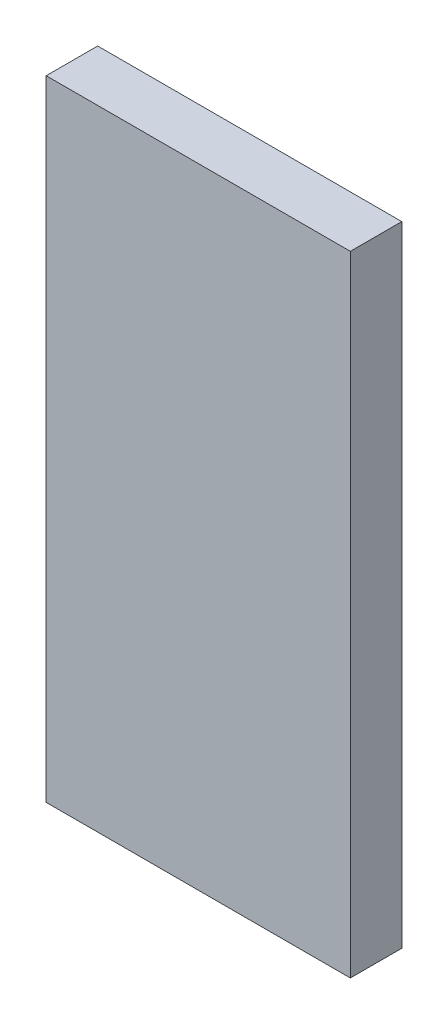
ISO-10303-21;
HEADER;
FILE_DESCRIPTION(('STEP AP214'),'2;1');
FILE_NAME('part.step','',(''),(''),'','','');
FILE_SCHEMA(('AUTOMOTIVE_DESIGN { 1 0 10303 214 1 1 1 1 }'));
ENDSEC;
DATA;
#1=APPLICATION_CONTEXT('core data for automotive mechanical design processes');
#2=APPLICATION_PROTOCOL_DEFINITION('international standard','automotive_design',2000,#1);
#3=PRODUCT_CONTEXT('',#1,'mechanical');
#4=PRODUCT('Part','Part','',(#3));
#5=PRODUCT_RELATED_PRODUCT_CATEGORY('part','',(#4));
#6=PRODUCT_DEFINITION_FORMATION('','',#4);
#7=PRODUCT_DEFINITION_CONTEXT('part definition',#1,'design');
#8=PRODUCT_DEFINITION('design','',#6,#7);
#9=PRODUCT_DEFINITION_SHAPE('','',#8);
#10=(LENGTH_UNIT() NAMED_UNIT(*) SI_UNIT(.MILLI.,.METRE.));
#11=(NAMED_UNIT(*) PLANE_ANGLE_UNIT() SI_UNIT($,.RADIAN.));
#12=(NAMED_UNIT(*) SI_UNIT($,.STERADIAN.) SOLID_ANGLE_UNIT());
#13=UNCERTAINTY_MEASURE_WITH_UNIT(LENGTH_MEASURE(1.E-05),#10,'distance_accuracy_value','');
#14=(GEOMETRIC_REPRESENTATION_CONTEXT(3) GLOBAL_UNCERTAINTY_ASSIGNED_CONTEXT((#13)) GLOBAL_UNIT_ASSIGNED_CONTEXT((#10,
#11,#12)) REPRESENTATION_CONTEXT('',''));
#15=CARTESIAN_POINT('',(0.,0.,0.));
#16=DIRECTION('',(0.,0.,1.));
#17=DIRECTION('',(1.,0.,0.));
#18=AXIS2_PLACEMENT_3D('',#15,#16,#17);
#19=CARTESIAN_POINT('',(6.5,-13.45,1.1));
#20=DIRECTION('',(-1.,0.,0.));
#21=DIRECTION('',(0.,0.,1.));
#22=AXIS2_PLACEMENT_3D('',#19,#20,#21);
#23=PLANE('',#22);
#24=DIRECTION('',(0.,1.,0.));
#25=VECTOR('',#24,1.);
#26=CARTESIAN_POINT('',(6.5,-13.45,-1.1));
#27=LINE('',#26,#25);
#28=CARTESIAN_POINT('',(6.5,-13.45,-1.1));
#29=VERTEX_POINT('',#28);
#30=CARTESIAN_POINT('',(6.5,13.45,-1.1));
#31=VERTEX_POINT('',#30);
#32=EDGE_CURVE('E96',#29,#31,#27,.T.);
#33=ORIENTED_EDGE('',*,*,#32,.T.);
#34=DIRECTION('',(0.,0.,-1.));
#35=VECTOR('',#34,1.);
#36=CARTESIAN_POINT('',(6.5,13.45,1.1));
#37=LINE('',#36,#35);
#38=CARTESIAN_POINT('',(6.5,13.45,1.1));
#39=VERTEX_POINT('',#38);
#40=EDGE_CURVE('E11',#39,#31,#37,.T.);
#41=ORIENTED_EDGE('',*,*,#40,.F.);
#42=DIRECTION('',(0.,1.,0.));
#43=VECTOR('',#42,1.);
#44=CARTESIAN_POINT('',(6.5,-13.45,1.1));
#45=LINE('',#44,#43);
#46=CARTESIAN_POINT('',(6.5,-13.45,1.1));
#47=VERTEX_POINT('',#46);
#48=EDGE_CURVE('E84',#47,#39,#45,.T.);
#49=ORIENTED_EDGE('',*,*,#48,.F.);
#50=DIRECTION('',(0.,0.,-1.));
#51=VECTOR('',#50,1.);
#52=CARTESIAN_POINT('',(6.5,-13.45,1.1));
#53=LINE('',#52,#51);
#54=EDGE_CURVE('E92',#47,#29,#53,.T.);
#55=ORIENTED_EDGE('',*,*,#54,.T.);
#56=EDGE_LOOP('',(#33,#41,#49,#55));
#57=FACE_BOUND('',#56,.T.);
#58=ADVANCED_FACE('F33',(#57),#23,.F.);
#59=CARTESIAN_POINT('',(-6.5,13.45,1.1));
#60=DIRECTION('',(0.,-1.,0.));
#61=DIRECTION('',(0.,0.,-1.));
#62=AXIS2_PLACEMENT_3D('',#59,#60,#61);
#63=PLANE('',#62);
#64=DIRECTION('',(-1.,0.,0.));
#65=VECTOR('',#64,1.);
#66=CARTESIAN_POINT('',(-6.5,13.45,-1.1));
#67=LINE('',#66,#65);
#68=CARTESIAN_POINT('',(-6.5,13.45,-1.1));
#69=VERTEX_POINT('',#68);
#70=EDGE_CURVE('E88',#31,#69,#67,.T.);
#71=ORIENTED_EDGE('',*,*,#70,.T.);
#72=DIRECTION('',(0.,0.,-1.));
#73=VECTOR('',#72,1.);
#74=CARTESIAN_POINT('',(-6.5,13.45,1.1));
#75=LINE('',#74,#73);
#76=CARTESIAN_POINT('',(-6.5,13.45,1.1));
#77=VERTEX_POINT('',#76);
#78=EDGE_CURVE('E41',#77,#69,#75,.T.);
#79=ORIENTED_EDGE('',*,*,#78,.F.);
#80=DIRECTION('',(-1.,0.,0.));
#81=VECTOR('',#80,1.);
#82=CARTESIAN_POINT('',(-6.5,13.45,1.1));
#83=LINE('',#82,#81);
#84=EDGE_CURVE('E79',#39,#77,#83,.T.);
#85=ORIENTED_EDGE('',*,*,#84,.F.);
#86=ORIENTED_EDGE('',*,*,#40,.T.);
#87=EDGE_LOOP('',(#71,#79,#85,#86));
#88=FACE_BOUND('',#87,.T.);
#89=ADVANCED_FACE('F87',(#88),#63,.F.);
#90=CARTESIAN_POINT('',(-6.5,-13.45,1.1));
#91=DIRECTION('',(1.,0.,0.));
#92=DIRECTION('',(0.,0.,-1.));
#93=AXIS2_PLACEMENT_3D('',#90,#91,#92);
#94=PLANE('',#93);
#95=DIRECTION('',(0.,-1.,0.));
#96=VECTOR('',#95,1.);
#97=CARTESIAN_POINT('',(-6.5,-13.45,-1.1));
#98=LINE('',#97,#96);
#99=CARTESIAN_POINT('',(-6.5,-13.45,-1.1));
#100=VERTEX_POINT('',#99);
#101=EDGE_CURVE('E66',#69,#100,#98,.T.);
#102=ORIENTED_EDGE('',*,*,#101,.T.);
#103=DIRECTION('',(0.,0.,-1.));
#104=VECTOR('',#103,1.);
#105=CARTESIAN_POINT('',(-6.5,-13.45,1.1));
#106=LINE('',#105,#104);
#107=CARTESIAN_POINT('',(-6.5,-13.45,1.1));
#108=VERTEX_POINT('',#107);
#109=EDGE_CURVE('E89',#108,#100,#106,.T.);
#110=ORIENTED_EDGE('',*,*,#109,.F.);
#111=DIRECTION('',(0.,-1.,0.));
#112=VECTOR('',#111,1.);
#113=CARTESIAN_POINT('',(-6.5,-13.45,1.1));
#114=LINE('',#113,#112);
#115=EDGE_CURVE('E82',#77,#108,#114,.T.);
#116=ORIENTED_EDGE('',*,*,#115,.F.);
#117=ORIENTED_EDGE('',*,*,#78,.T.);
#118=EDGE_LOOP('',(#102,#110,#116,#117));
#119=FACE_BOUND('',#118,.T.);
#120=ADVANCED_FACE('F90',(#119),#94,.F.);
#121=CARTESIAN_POINT('',(-6.5,-13.45,1.1));
#122=DIRECTION('',(0.,1.,0.));
#123=DIRECTION('',(0.,0.,1.));
#124=AXIS2_PLACEMENT_3D('',#121,#122,#123);
#125=PLANE('',#124);
#126=DIRECTION('',(1.,0.,0.));
#127=VECTOR('',#126,1.);
#128=CARTESIAN_POINT('',(-6.5,-13.45,-1.1));
#129=LINE('',#128,#127);
#130=EDGE_CURVE('E72',#100,#29,#129,.T.);
#131=ORIENTED_EDGE('',*,*,#130,.T.);
#132=ORIENTED_EDGE('',*,*,#54,.F.);
#133=DIRECTION('',(1.,0.,0.));
#134=VECTOR('',#133,1.);
#135=CARTESIAN_POINT('',(-6.5,-13.45,1.1));
#136=LINE('',#135,#134);
#137=EDGE_CURVE('E49',#108,#47,#136,.T.);
#138=ORIENTED_EDGE('',*,*,#137,.F.);
#139=ORIENTED_EDGE('',*,*,#109,.T.);
#140=EDGE_LOOP('',(#131,#132,#138,#139));
#141=FACE_BOUND('',#140,.T.);
#142=ADVANCED_FACE('F103',(#141),#125,.F.);
#143=CARTESIAN_POINT('',(0.,0.,1.1));
#144=DIRECTION('',(0.,0.,-1.));
#145=DIRECTION('',(-1.,0.,0.));
#146=AXIS2_PLACEMENT_3D('',#143,#144,#145);
#147=PLANE('',#146);
#148=ORIENTED_EDGE('',*,*,#48,.T.);
#149=ORIENTED_EDGE('',*,*,#84,.T.);
#150=ORIENTED_EDGE('',*,*,#115,.T.);
#151=ORIENTED_EDGE('',*,*,#137,.T.);
#152=EDGE_LOOP('',(#148,#149,#150,#151));
#153=FACE_BOUND('',#152,.T.);
#154=ADVANCED_FACE('F80',(#153),#147,.F.);
#155=CARTESIAN_POINT('',(0.,0.,-1.1));
#156=DIRECTION('',(0.,0.,-1.));
#157=DIRECTION('',(-1.,0.,0.));
#158=AXIS2_PLACEMENT_3D('',#155,#156,#157);
#159=PLANE('',#158);
#160=ORIENTED_EDGE('',*,*,#32,.F.);
#161=ORIENTED_EDGE('',*,*,#130,.F.);
#162=ORIENTED_EDGE('',*,*,#101,.F.);
#163=ORIENTED_EDGE('',*,*,#70,.F.);
#164=EDGE_LOOP('',(#160,#161,#162,#163));
#165=FACE_BOUND('',#164,.T.);
#166=ADVANCED_FACE('F106',(#165),#159,.T.);
#167=CLOSED_SHELL('',(#58,#89,#120,#142,#154,#166));
#168=MANIFOLD_SOLID_BREP('B2',#167);
#169=ADVANCED_BREP_SHAPE_REPRESENTATION('',(#18,#168),#14);
#170=SHAPE_DEFINITION_REPRESENTATION(#9,#169);
ENDSEC;
END-ISO-10303-21;
